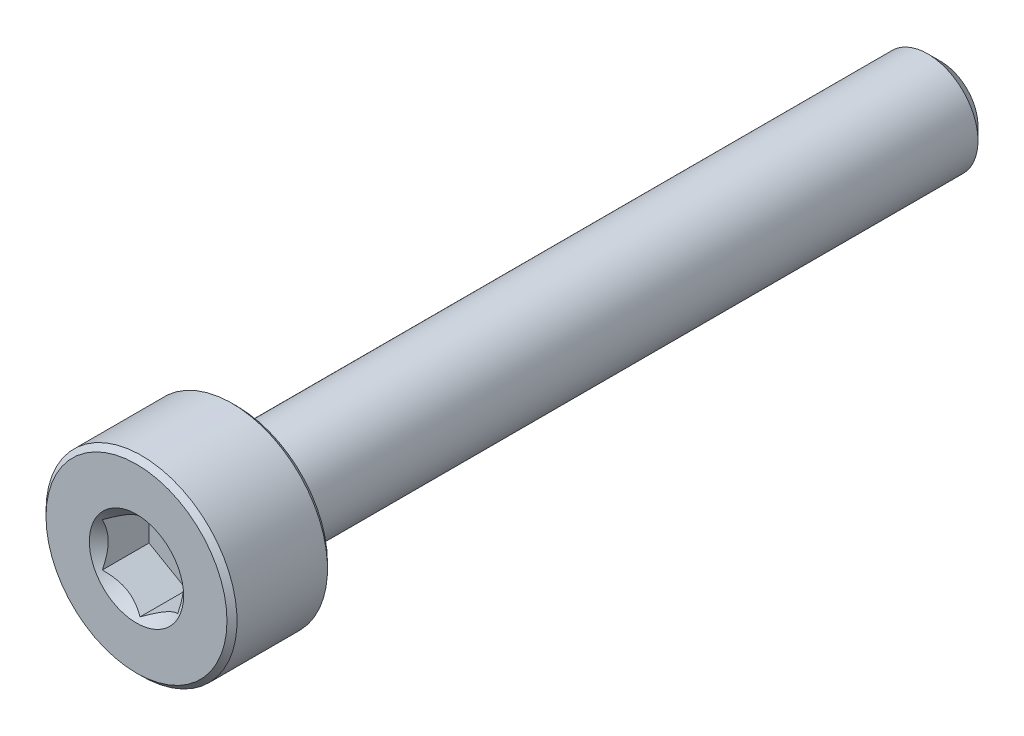
ISO-10303-21;
HEADER;
FILE_DESCRIPTION(('STEP AP214'),'2;1');
FILE_NAME('part.step','',(''),(''),'','','');
FILE_SCHEMA(('AUTOMOTIVE_DESIGN { 1 0 10303 214 1 1 1 1 }'));
ENDSEC;
DATA;
#1=APPLICATION_CONTEXT('core data for automotive mechanical design processes');
#2=APPLICATION_PROTOCOL_DEFINITION('international standard','automotive_design',2000,#1);
#3=PRODUCT_CONTEXT('',#1,'mechanical');
#4=PRODUCT('Part','Part','',(#3));
#5=PRODUCT_RELATED_PRODUCT_CATEGORY('part','',(#4));
#6=PRODUCT_DEFINITION_FORMATION('','',#4);
#7=PRODUCT_DEFINITION_CONTEXT('part definition',#1,'design');
#8=PRODUCT_DEFINITION('design','',#6,#7);
#9=PRODUCT_DEFINITION_SHAPE('','',#8);
#10=(LENGTH_UNIT() NAMED_UNIT(*) SI_UNIT(.MILLI.,.METRE.));
#11=(NAMED_UNIT(*) PLANE_ANGLE_UNIT() SI_UNIT($,.RADIAN.));
#12=(NAMED_UNIT(*) SI_UNIT($,.STERADIAN.) SOLID_ANGLE_UNIT());
#13=UNCERTAINTY_MEASURE_WITH_UNIT(LENGTH_MEASURE(1.E-05),#10,'distance_accuracy_value','');
#14=(GEOMETRIC_REPRESENTATION_CONTEXT(3) GLOBAL_UNCERTAINTY_ASSIGNED_CONTEXT((#13)) GLOBAL_UNIT_ASSIGNED_CONTEXT((#10,
#11,#12)) REPRESENTATION_CONTEXT('',''));
#15=CARTESIAN_POINT('',(0.,0.,0.));
#16=DIRECTION('',(0.,0.,1.));
#17=DIRECTION('',(1.,0.,0.));
#18=AXIS2_PLACEMENT_3D('',#15,#16,#17);
#19=CARTESIAN_POINT('',(0.,0.740192378864671,-8.));
#20=DIRECTION('',(0.,0.,-1.));
#21=DIRECTION('',(-1.,0.,0.));
#22=AXIS2_PLACEMENT_3D('',#19,#20,#21);
#23=PLANE('',#22);
#24=CARTESIAN_POINT('',(0.,0.,-8.));
#25=DIRECTION('',(0.,0.,-1.));
#26=DIRECTION('',(-1.,0.,0.));
#27=AXIS2_PLACEMENT_3D('',#24,#25,#26);
#28=CIRCLE('',#27,0.740192378864671);
#29=CARTESIAN_POINT('',(-0.740192378864671,0.,-8.));
#30=VERTEX_POINT('',#29);
#31=EDGE_CURVE('E56',#30,#30,#28,.T.);
#32=ORIENTED_EDGE('',*,*,#31,.T.);
#33=EDGE_LOOP('',(#32));
#34=FACE_BOUND('',#33,.T.);
#35=ADVANCED_FACE('F43',(#34),#23,.T.);
#36=CARTESIAN_POINT('',(0.,0.,-8.));
#37=DIRECTION('',(0.,0.,1.));
#38=DIRECTION('',(1.,0.,0.));
#39=AXIS2_PLACEMENT_3D('',#36,#37,#38);
#40=CONICAL_SURFACE('',#39,0.740192378864671,0.785398163397445);
#41=CARTESIAN_POINT('',(0.,0.,-7.74019237886467));
#42=DIRECTION('',(0.,0.,-1.));
#43=DIRECTION('',(-1.,0.,0.));
#44=AXIS2_PLACEMENT_3D('',#41,#42,#43);
#45=CIRCLE('',#44,1.);
#46=CARTESIAN_POINT('',(-1.,0.,-7.74019237886467));
#47=VERTEX_POINT('',#46);
#48=EDGE_CURVE('E159',#47,#47,#45,.T.);
#49=ORIENTED_EDGE('',*,*,#48,.T.);
#50=EDGE_LOOP('',(#49));
#51=FACE_BOUND('',#50,.T.);
#52=ORIENTED_EDGE('',*,*,#31,.F.);
#53=EDGE_LOOP('',(#52));
#54=FACE_BOUND('',#53,.T.);
#55=ADVANCED_FACE('F165',(#51,#54),#40,.T.);
#56=CARTESIAN_POINT('',(0.,0.,-8.));
#57=DIRECTION('',(0.,0.,-1.));
#58=DIRECTION('',(-1.,0.,0.));
#59=AXIS2_PLACEMENT_3D('',#56,#57,#58);
#60=CYLINDRICAL_SURFACE('',#59,1.);
#61=CARTESIAN_POINT('',(0.,0.,5.8));
#62=DIRECTION('',(0.,0.,-1.));
#63=DIRECTION('',(-1.,0.,0.));
#64=AXIS2_PLACEMENT_3D('',#61,#62,#63);
#65=CIRCLE('',#64,1.);
#66=CARTESIAN_POINT('',(-1.,0.,5.8));
#67=VERTEX_POINT('',#66);
#68=EDGE_CURVE('E156',#67,#67,#65,.T.);
#69=ORIENTED_EDGE('',*,*,#68,.T.);
#70=EDGE_LOOP('',(#69));
#71=FACE_BOUND('',#70,.T.);
#72=ORIENTED_EDGE('',*,*,#48,.F.);
#73=EDGE_LOOP('',(#72));
#74=FACE_BOUND('',#73,.T.);
#75=ADVANCED_FACE('F167',(#71,#74),#60,.T.);
#76=CARTESIAN_POINT('',(0.,0.,5.8));
#77=DIRECTION('',(0.,0.,-1.));
#78=DIRECTION('',(-1.,0.,0.));
#79=AXIS2_PLACEMENT_3D('',#76,#77,#78);
#80=TOROIDAL_SURFACE('',#79,1.2,0.199999999999999);
#81=CARTESIAN_POINT('',(0.,0.,6.));
#82=DIRECTION('',(0.,0.,-1.));
#83=DIRECTION('',(-1.,0.,0.));
#84=AXIS2_PLACEMENT_3D('',#81,#82,#83);
#85=CIRCLE('',#84,1.2);
#86=CARTESIAN_POINT('',(-1.2,0.,6.));
#87=VERTEX_POINT('',#86);
#88=EDGE_CURVE('E153',#87,#87,#85,.T.);
#89=ORIENTED_EDGE('',*,*,#88,.T.);
#90=EDGE_LOOP('',(#89));
#91=FACE_BOUND('',#90,.T.);
#92=ORIENTED_EDGE('',*,*,#68,.F.);
#93=EDGE_LOOP('',(#92));
#94=FACE_BOUND('',#93,.T.);
#95=ADVANCED_FACE('F173',(#91,#94),#80,.F.);
#96=CARTESIAN_POINT('',(0.,1.8,6.));
#97=DIRECTION('',(0.,0.,-1.));
#98=DIRECTION('',(-1.,0.,0.));
#99=AXIS2_PLACEMENT_3D('',#96,#97,#98);
#100=PLANE('',#99);
#101=CARTESIAN_POINT('',(0.,0.,6.));
#102=DIRECTION('',(0.,0.,-1.));
#103=DIRECTION('',(-1.,0.,0.));
#104=AXIS2_PLACEMENT_3D('',#101,#102,#103);
#105=CIRCLE('',#104,1.8);
#106=CARTESIAN_POINT('',(-1.8,0.,6.));
#107=VERTEX_POINT('',#106);
#108=EDGE_CURVE('E150',#107,#107,#105,.T.);
#109=ORIENTED_EDGE('',*,*,#108,.T.);
#110=EDGE_LOOP('',(#109));
#111=FACE_BOUND('',#110,.T.);
#112=ORIENTED_EDGE('',*,*,#88,.F.);
#113=EDGE_LOOP('',(#112));
#114=FACE_BOUND('',#113,.T.);
#115=ADVANCED_FACE('F179',(#111,#114),#100,.T.);
#116=CARTESIAN_POINT('',(0.,0.,6.));
#117=DIRECTION('',(0.,0.,1.));
#118=DIRECTION('',(1.,0.,0.));
#119=AXIS2_PLACEMENT_3D('',#116,#117,#118);
#120=CONICAL_SURFACE('',#119,1.8,0.785398163397452);
#121=CARTESIAN_POINT('',(0.,0.,6.1));
#122=DIRECTION('',(0.,0.,-1.));
#123=DIRECTION('',(-1.,0.,0.));
#124=AXIS2_PLACEMENT_3D('',#121,#122,#123);
#125=CIRCLE('',#124,1.9);
#126=CARTESIAN_POINT('',(-1.9,0.,6.1));
#127=VERTEX_POINT('',#126);
#128=EDGE_CURVE('E147',#127,#127,#125,.T.);
#129=ORIENTED_EDGE('',*,*,#128,.T.);
#130=EDGE_LOOP('',(#129));
#131=FACE_BOUND('',#130,.T.);
#132=ORIENTED_EDGE('',*,*,#108,.F.);
#133=EDGE_LOOP('',(#132));
#134=FACE_BOUND('',#133,.T.);
#135=ADVANCED_FACE('F183',(#131,#134),#120,.T.);
#136=CARTESIAN_POINT('',(0.,0.,-8.));
#137=DIRECTION('',(0.,0.,-1.));
#138=DIRECTION('',(-1.,0.,0.));
#139=AXIS2_PLACEMENT_3D('',#136,#137,#138);
#140=CYLINDRICAL_SURFACE('',#139,1.9);
#141=CARTESIAN_POINT('',(0.,0.,7.9));
#142=DIRECTION('',(0.,0.,-1.));
#143=DIRECTION('',(-1.,0.,0.));
#144=AXIS2_PLACEMENT_3D('',#141,#142,#143);
#145=CIRCLE('',#144,1.9);
#146=CARTESIAN_POINT('',(-1.9,0.,7.9));
#147=VERTEX_POINT('',#146);
#148=EDGE_CURVE('E144',#147,#147,#145,.T.);
#149=ORIENTED_EDGE('',*,*,#148,.T.);
#150=EDGE_LOOP('',(#149));
#151=FACE_BOUND('',#150,.T.);
#152=ORIENTED_EDGE('',*,*,#128,.F.);
#153=EDGE_LOOP('',(#152));
#154=FACE_BOUND('',#153,.T.);
#155=ADVANCED_FACE('F187',(#151,#154),#140,.T.);
#156=CARTESIAN_POINT('',(0.,0.,7.9));
#157=DIRECTION('',(0.,0.,-1.));
#158=DIRECTION('',(-1.,0.,0.));
#159=AXIS2_PLACEMENT_3D('',#156,#157,#158);
#160=CONICAL_SURFACE('',#159,1.9,0.785398163397452);
#161=CARTESIAN_POINT('',(0.,0.,8.));
#162=DIRECTION('',(0.,0.,-1.));
#163=DIRECTION('',(-1.,0.,0.));
#164=AXIS2_PLACEMENT_3D('',#161,#162,#163);
#165=CIRCLE('',#164,1.8);
#166=CARTESIAN_POINT('',(-1.8,0.,8.));
#167=VERTEX_POINT('',#166);
#168=EDGE_CURVE('E141',#167,#167,#165,.T.);
#169=ORIENTED_EDGE('',*,*,#168,.T.);
#170=EDGE_LOOP('',(#169));
#171=FACE_BOUND('',#170,.T.);
#172=ORIENTED_EDGE('',*,*,#148,.F.);
#173=EDGE_LOOP('',(#172));
#174=FACE_BOUND('',#173,.T.);
#175=ADVANCED_FACE('F191',(#171,#174),#160,.T.);
#176=CARTESIAN_POINT('',(0.,0.,8.));
#177=DIRECTION('',(0.,0.,1.));
#178=DIRECTION('',(1.,0.,0.));
#179=AXIS2_PLACEMENT_3D('',#176,#177,#178);
#180=PLANE('',#179);
#181=CARTESIAN_POINT('',(0.,0.,8.));
#182=DIRECTION('',(0.,0.,1.));
#183=DIRECTION('',(1.,0.,0.));
#184=AXIS2_PLACEMENT_3D('',#181,#182,#183);
#185=CIRCLE('',#184,0.9375);
#186=CARTESIAN_POINT('',(0.9375,0.,8.));
#187=VERTEX_POINT('',#186);
#188=EDGE_CURVE('E115',#187,#187,#185,.T.);
#189=ORIENTED_EDGE('',*,*,#188,.F.);
#190=EDGE_LOOP('',(#189));
#191=FACE_BOUND('',#190,.T.);
#192=ORIENTED_EDGE('',*,*,#168,.F.);
#193=EDGE_LOOP('',(#192));
#194=FACE_BOUND('',#193,.T.);
#195=ADVANCED_FACE('F195',(#191,#194),#180,.T.);
#196=CARTESIAN_POINT('',(0.,0.,8.));
#197=DIRECTION('',(0.,0.,1.));
#198=DIRECTION('',(1.,0.,0.));
#199=AXIS2_PLACEMENT_3D('',#196,#197,#198);
#200=CONICAL_SURFACE('',#199,0.9375,0.78539816339745);
#201=ORIENTED_EDGE('',*,*,#188,.T.);
#202=EDGE_LOOP('',(#201));
#203=FACE_BOUND('',#202,.T.);
#204=CARTESIAN_POINT('',(-0.000199999999999958,-0.866140873838277,7.92864089692921));
#205=CARTESIAN_POINT('',(0.0255899625576813,-0.851251032013209,7.91375951424836));
#206=CARTESIAN_POINT('',(0.0518112021286592,-0.836112192288419,7.89975166939139));
#207=CARTESIAN_POINT('',(0.105279708235707,-0.805242135894348,7.8741029284667));
#208=CARTESIAN_POINT('',(0.132532067460573,-0.789507978959819,7.86247631549011));
#209=CARTESIAN_POINT('',(0.187485350381353,-0.757780686272653,7.84255944955668));
#210=CARTESIAN_POINT('',(0.21517225669551,-0.741795643459147,7.83421909786581));
#211=CARTESIAN_POINT('',(0.271155595130854,-0.709473647943367,7.82136814574587));
#212=CARTESIAN_POINT('',(0.299450314843646,-0.693137683900542,7.81684794437328));
#213=CARTESIAN_POINT('',(0.348210289268844,-0.664986099540474,7.81277123688187));
#214=CARTESIAN_POINT('',(0.368612065655573,-0.65320712845165,7.81216820039852));
#215=CARTESIAN_POINT('',(0.409376134696361,-0.629671982217686,7.81317990979997));
#216=CARTESIAN_POINT('',(0.429738417651456,-0.617915812672247,7.81479514477447));
#217=CARTESIAN_POINT('',(0.490534543086825,-0.582815153286451,7.82286155075748));
#218=CARTESIAN_POINT('',(0.5306658549961,-0.559645329552698,7.83253433961216));
#219=CARTESIAN_POINT('',(0.601110400354026,-0.518974152327358,7.85588172175675));
#220=CARTESIAN_POINT('',(0.631753572009087,-0.501282308923485,7.86833396185669));
#221=CARTESIAN_POINT('',(0.69183934580479,-0.466591771248069,7.8963850140153));
#222=CARTESIAN_POINT('',(0.721285488381591,-0.449591032904757,7.91197358968819));
#223=CARTESIAN_POINT('',(0.7502,-0.432897231838382,7.92864089692921));
#224=B_SPLINE_CURVE_WITH_KNOTS('',3,(#204,#205,#206,#207,#208,#209,#210,#211,#212,#213,#214,
#215,#216,#217,#218,#219,#220,#221,#222,#223),.UNSPECIFIED.,.F.,.F.,(4,2,2,2,2,2,2,2,2,4),(0.,
0.0999419466095602,0.200466857654446,0.299393763705718,0.398071297300231,0.468665775681748,
0.53927582139884,0.680536257244567,0.792918418368074,0.904939568716031),.UNSPECIFIED.);
#225=CARTESIAN_POINT('',(0.,-0.866025403784439,7.92852540378444));
#226=VERTEX_POINT('',#225);
#227=CARTESIAN_POINT('',(0.75,-0.43301270189222,7.92852540378444));
#228=VERTEX_POINT('',#227);
#229=EDGE_CURVE('E12',#226,#228,#224,.T.);
#230=ORIENTED_EDGE('',*,*,#229,.F.);
#231=CARTESIAN_POINT('',(-0.7502,-0.432897231838382,7.92864089692921));
#232=CARTESIAN_POINT('',(-0.724410037442318,-0.447787073663449,7.91375951424836));
#233=CARTESIAN_POINT('',(-0.69818879787134,-0.462925913388239,7.89975166939139));
#234=CARTESIAN_POINT('',(-0.644720291764293,-0.49379596978231,7.8741029284667));
#235=CARTESIAN_POINT('',(-0.617467932539427,-0.509530126716839,7.8624763154901));
#236=CARTESIAN_POINT('',(-0.562514649618646,-0.541257419404006,7.84255944955668));
#237=CARTESIAN_POINT('',(-0.53482774330449,-0.557242462217512,7.83421909786581));
#238=CARTESIAN_POINT('',(-0.478844404869146,-0.589564457733291,7.82136814574587));
#239=CARTESIAN_POINT('',(-0.450549685156354,-0.605900421776116,7.81684794437327));
#240=CARTESIAN_POINT('',(-0.401789710731156,-0.634052006136184,7.81277123688187));
#241=CARTESIAN_POINT('',(-0.381387934344427,-0.645830977225009,7.81216820039852));
#242=CARTESIAN_POINT('',(-0.340623865303639,-0.669366123458972,7.81317990979997));
#243=CARTESIAN_POINT('',(-0.320261582348544,-0.681122293004411,7.81479514477447));
#244=CARTESIAN_POINT('',(-0.259465456913175,-0.716222952390208,7.82286155075748));
#245=CARTESIAN_POINT('',(-0.2193341450039,-0.739392776123961,7.83253433961216));
#246=CARTESIAN_POINT('',(-0.148889599645974,-0.7800639533493,7.85588172175675));
#247=CARTESIAN_POINT('',(-0.118246427990913,-0.797755796753173,7.86833396185669));
#248=CARTESIAN_POINT('',(-0.05816065419521,-0.83244633442859,7.8963850140153));
#249=CARTESIAN_POINT('',(-0.0287145116184093,-0.849447072771901,7.91197358968819));
#250=CARTESIAN_POINT('',(0.000199999999999707,-0.866140873838276,7.92864089692921));
#251=B_SPLINE_CURVE_WITH_KNOTS('',3,(#231,#232,#233,#234,#235,#236,#237,#238,#239,#240,#241,
#242,#243,#244,#245,#246,#247,#248,#249,#250),.UNSPECIFIED.,.F.,.F.,(4,2,2,2,2,2,2,2,2,4),(0.,
0.0999419466095602,0.200466857654447,0.299393763705718,0.398071297300231,0.468665775681748,
0.53927582139884,0.680536257244567,0.792918418368074,0.904939568716031),.UNSPECIFIED.);
#252=CARTESIAN_POINT('',(-0.749999999999999,-0.43301270189222,7.92852540378444));
#253=VERTEX_POINT('',#252);
#254=EDGE_CURVE('E101',#253,#226,#251,.T.);
#255=ORIENTED_EDGE('',*,*,#254,.F.);
#256=CARTESIAN_POINT('',(-0.749999999999999,-0.913623081515065,8.24453516659915));
#257=CARTESIAN_POINT('',(-0.749999999999999,-0.891587934056342,8.22750617490328));
#258=CARTESIAN_POINT('',(-0.749999999999999,-0.869435609302313,8.2106292698566));
#259=CARTESIAN_POINT('',(-0.749999999999999,-0.824847362255834,8.17724385668654));
#260=CARTESIAN_POINT('',(-0.749999999999999,-0.802411375588701,8.16073543462633));
#261=CARTESIAN_POINT('',(-0.749999999999999,-0.734276071637828,8.11162355047093));
#262=CARTESIAN_POINT('',(-0.75,-0.688082871753294,8.07969436020913));
#263=CARTESIAN_POINT('',(-0.75,-0.590878824423271,8.01653286106833));
#264=CARTESIAN_POINT('',(-0.75,-0.539749896042761,7.98548034048947));
#265=CARTESIAN_POINT('',(-0.75,-0.434881984782017,7.92834813059631));
#266=CARTESIAN_POINT('',(-0.75,-0.381152620431967,7.90225164613688));
#267=CARTESIAN_POINT('',(-0.75,-0.300958051798766,7.8703142834118));
#268=CARTESIAN_POINT('',(-0.75,-0.275793033906304,7.86123826752818));
#269=CARTESIAN_POINT('',(-0.75,-0.224826538126441,7.84509659728151));
#270=CARTESIAN_POINT('',(-0.75,-0.199025020520126,7.83803106872369));
#271=CARTESIAN_POINT('',(-0.75,-0.121798778348913,7.82071041981678));
#272=CARTESIAN_POINT('',(-0.75,-0.0695159130538485,7.81388815020023));
#273=CARTESIAN_POINT('',(-0.75,0.0329231759441416,7.81155614914664));
#274=CARTESIAN_POINT('',(-0.75,0.0830673936221563,7.8155436776996));
#275=CARTESIAN_POINT('',(-0.75,0.157437365189135,7.82843772151154));
#276=CARTESIAN_POINT('',(-0.75,0.182318088526611,7.83397445658713));
#277=CARTESIAN_POINT('',(-0.75,0.231540192191707,7.84707138969148));
#278=CARTESIAN_POINT('',(-0.75,0.255881599358774,7.8546314867802));
#279=CARTESIAN_POINT('',(-0.75,0.330397144501019,7.8806790666465));
#280=CARTESIAN_POINT('',(-0.75,0.379559057166921,7.90204407345706));
#281=CARTESIAN_POINT('',(-0.75,0.475591510108889,7.94959498765407));
#282=CARTESIAN_POINT('',(-0.75,0.522453259746742,7.97579780486856));
#283=CARTESIAN_POINT('',(-0.75,0.61203536346179,8.02990968941325));
#284=CARTESIAN_POINT('',(-0.75,0.654846018126321,8.05767119410216));
#285=CARTESIAN_POINT('',(-0.75,0.717918628006985,8.10061102002081));
#286=CARTESIAN_POINT('',(-0.75,0.738671754913954,8.11508031004262));
#287=CARTESIAN_POINT('',(-0.75,0.779893140743972,8.14440776475374));
#288=CARTESIAN_POINT('',(-0.75,0.800361476224038,8.15926582171623));
#289=CARTESIAN_POINT('',(-0.75,0.820710970137172,8.17428527445883));
#290=B_SPLINE_CURVE_WITH_KNOTS('',3,(#256,#257,#258,#259,#260,#261,#262,#263,#264,#265,#266,
#267,#268,#269,#270,#271,#272,#273,#274,#275,#276,#277,#278,#279,#280,#281,#282,#283,#284,#285,
#286,#287,#288,#289),.UNSPECIFIED.,.F.,.F.,(4,2,2,2,2,2,2,2,2,2,2,2,2,2,2,2,4),(0.,
0.0835433027134516,0.167105917903213,0.335500649126496,0.514826793989733,0.693533944085575,
0.773715029057593,0.853901130217463,1.01093644141579,1.1607951616589,1.2371879502019,
1.31357692842629,1.47392517984358,1.63484489590006,1.78784031994658,1.86373509862529,
1.93960906513721),.UNSPECIFIED.);
#291=CARTESIAN_POINT('',(-0.75,0.43301270189222,7.92852540378444));
#292=VERTEX_POINT('',#291);
#293=EDGE_CURVE('E114',#292,#253,#290,.F.);
#294=ORIENTED_EDGE('',*,*,#293,.F.);
#295=CARTESIAN_POINT('',(0.000200000000000048,0.866140873838277,7.92864089692921));
#296=CARTESIAN_POINT('',(-0.0255899625576813,0.851251032013209,7.91375951424836));
#297=CARTESIAN_POINT('',(-0.0518112021286588,0.836112192288419,7.8997516693914));
#298=CARTESIAN_POINT('',(-0.105279708235706,0.805242135894349,7.8741029284667));
#299=CARTESIAN_POINT('',(-0.132532067460572,0.78950797895982,7.86247631549011));
#300=CARTESIAN_POINT('',(-0.187485350381352,0.757780686272654,7.84255944955668));
#301=CARTESIAN_POINT('',(-0.215172256695509,0.741795643459148,7.83421909786581));
#302=CARTESIAN_POINT('',(-0.271155595130853,0.709473647943368,7.82136814574587));
#303=CARTESIAN_POINT('',(-0.299450314843645,0.693137683900543,7.81684794437328));
#304=CARTESIAN_POINT('',(-0.348210289268843,0.664986099540475,7.81277123688187));
#305=CARTESIAN_POINT('',(-0.368612065655572,0.65320712845165,7.81216820039852));
#306=CARTESIAN_POINT('',(-0.40937613469636,0.629671982217687,7.81317990979997));
#307=CARTESIAN_POINT('',(-0.429738417651455,0.617915812672248,7.81479514477447));
#308=CARTESIAN_POINT('',(-0.490534543086824,0.582815153286451,7.82286155075748));
#309=CARTESIAN_POINT('',(-0.530665854996099,0.559645329552698,7.83253433961216));
#310=CARTESIAN_POINT('',(-0.601110400354026,0.518974152327359,7.85588172175675));
#311=CARTESIAN_POINT('',(-0.631753572009086,0.501282308923486,7.86833396185669));
#312=CARTESIAN_POINT('',(-0.691839345804789,0.46659177124807,7.8963850140153));
#313=CARTESIAN_POINT('',(-0.72128548838159,0.449591032904757,7.91197358968819));
#314=CARTESIAN_POINT('',(-0.750199999999999,0.432897231838382,7.92864089692921));
#315=B_SPLINE_CURVE_WITH_KNOTS('',3,(#295,#296,#297,#298,#299,#300,#301,#302,#303,#304,#305,
#306,#307,#308,#309,#310,#311,#312,#313,#314),.UNSPECIFIED.,.F.,.F.,(4,2,2,2,2,2,2,2,2,4),(0.,
0.0999419466095586,0.200466857654445,0.299393763705717,0.39807129730023,0.468665775681747,
0.539275821398839,0.680536257244566,0.792918418368073,0.904939568716031),.UNSPECIFIED.);
#316=CARTESIAN_POINT('',(0.,0.866025403784439,7.92852540378444));
#317=VERTEX_POINT('',#316);
#318=EDGE_CURVE('E245',#317,#292,#315,.T.);
#319=ORIENTED_EDGE('',*,*,#318,.F.);
#320=CARTESIAN_POINT('',(0.7502,0.432897231838382,7.92864089692921));
#321=CARTESIAN_POINT('',(0.724410037442318,0.44778707366345,7.91375951424836));
#322=CARTESIAN_POINT('',(0.69818879787134,0.46292591338824,7.8997516693914));
#323=CARTESIAN_POINT('',(0.644720291764293,0.49379596978231,7.8741029284667));
#324=CARTESIAN_POINT('',(0.617467932539427,0.509530126716839,7.86247631549011));
#325=CARTESIAN_POINT('',(0.562514649618647,0.541257419404006,7.84255944955668));
#326=CARTESIAN_POINT('',(0.53482774330449,0.557242462217512,7.83421909786581));
#327=CARTESIAN_POINT('',(0.478844404869147,0.589564457733291,7.82136814574587));
#328=CARTESIAN_POINT('',(0.450549685156355,0.605900421776116,7.81684794437328));
#329=CARTESIAN_POINT('',(0.401789710731157,0.634052006136184,7.81277123688187));
#330=CARTESIAN_POINT('',(0.381387934344427,0.645830977225009,7.81216820039852));
#331=CARTESIAN_POINT('',(0.34062386530364,0.669366123458972,7.81317990979997));
#332=CARTESIAN_POINT('',(0.320261582348545,0.681122293004411,7.81479514477447));
#333=CARTESIAN_POINT('',(0.259465456913176,0.716222952390208,7.82286155075748));
#334=CARTESIAN_POINT('',(0.219334145003901,0.73939277612396,7.83253433961216));
#335=CARTESIAN_POINT('',(0.148889599645974,0.7800639533493,7.85588172175675));
#336=CARTESIAN_POINT('',(0.118246427990914,0.797755796753173,7.86833396185669));
#337=CARTESIAN_POINT('',(0.0581606541952104,0.832446334428589,7.8963850140153));
#338=CARTESIAN_POINT('',(0.0287145116184094,0.849447072771901,7.91197358968819));
#339=CARTESIAN_POINT('',(-0.000199999999999654,0.866140873838277,7.92864089692921));
#340=B_SPLINE_CURVE_WITH_KNOTS('',3,(#320,#321,#322,#323,#324,#325,#326,#327,#328,#329,#330,
#331,#332,#333,#334,#335,#336,#337,#338,#339),.UNSPECIFIED.,.F.,.F.,(4,2,2,2,2,2,2,2,2,4),(0.,
0.0999419466095597,0.200466857654446,0.299393763705717,0.39807129730023,0.468665775681747,
0.539275821398839,0.680536257244566,0.792918418368073,0.904939568716031),.UNSPECIFIED.);
#341=CARTESIAN_POINT('',(0.75,0.43301270189222,7.92852540378444));
#342=VERTEX_POINT('',#341);
#343=EDGE_CURVE('E218',#342,#317,#340,.T.);
#344=ORIENTED_EDGE('',*,*,#343,.F.);
#345=CARTESIAN_POINT('',(0.75,-0.913623162143353,8.24453522891867));
#346=CARTESIAN_POINT('',(0.75,-0.891588012342561,8.22750623480797));
#347=CARTESIAN_POINT('',(0.75,-0.869435685239549,8.21062932735027));
#348=CARTESIAN_POINT('',(0.75,-0.824847433472996,8.17724390937191));
#349=CARTESIAN_POINT('',(0.75,-0.802411444434766,8.16073548491442));
#350=CARTESIAN_POINT('',(0.75,-0.734276133230785,8.11162359351943));
#351=CARTESIAN_POINT('',(0.75,-0.688082928418122,8.0796943984501));
#352=CARTESIAN_POINT('',(0.75,-0.590878870331563,8.01653288937767));
#353=CARTESIAN_POINT('',(0.75,-0.539749936093781,7.98548036371058));
#354=CARTESIAN_POINT('',(0.75,-0.43488201262553,7.92834814436712));
#355=CARTESIAN_POINT('',(0.75,-0.381152641929382,7.90225165553938));
#356=CARTESIAN_POINT('',(0.75,-0.300958068560203,7.8703142897134));
#357=CARTESIAN_POINT('',(0.75,-0.275793052729062,7.86123827409276));
#358=CARTESIAN_POINT('',(0.75,-0.22482656115005,7.84509660396467));
#359=CARTESIAN_POINT('',(0.75,-0.199025045683182,7.83803107526269));
#360=CARTESIAN_POINT('',(0.75,-0.12179880979148,7.82071042514642));
#361=CARTESIAN_POINT('',(0.75,-0.0695159487001801,7.81388815376272));
#362=CARTESIAN_POINT('',(0.75,0.0329231335148145,7.81155614748937));
#363=CARTESIAN_POINT('',(0.75,0.0830673485907532,7.81554367284219));
#364=CARTESIAN_POINT('',(0.75,0.157437316619036,7.82843771156002));
#365=CARTESIAN_POINT('',(0.75,0.182318038779739,7.83397444485178));
#366=CARTESIAN_POINT('',(0.75,0.231540140218073,7.84707137437245));
#367=CARTESIAN_POINT('',(0.75,0.255881546335133,7.85463146966138));
#368=CARTESIAN_POINT('',(0.75,0.330397080263752,7.88067904120024));
#369=CARTESIAN_POINT('',(0.75,0.37955898333088,7.90204404037615));
#370=CARTESIAN_POINT('',(0.75,0.475591417813352,7.94959493845518));
#371=CARTESIAN_POINT('',(0.75,0.522453158594996,7.97579774718032));
#372=CARTESIAN_POINT('',(0.75,0.612035246419323,8.02990961548259));
#373=CARTESIAN_POINT('',(0.75,0.654845893991357,8.05767111249543));
#374=CARTESIAN_POINT('',(0.75,0.717918493386946,8.10061092693989));
#375=CARTESIAN_POINT('',(0.75,0.738671616849601,8.11508021316739));
#376=CARTESIAN_POINT('',(0.75,0.77989299581379,8.14440766029472));
#377=CARTESIAN_POINT('',(0.75,0.800361327872347,8.15926571346771));
#378=CARTESIAN_POINT('',(0.75,0.820710818370217,8.17428516242569));
#379=B_SPLINE_CURVE_WITH_KNOTS('',3,(#345,#346,#347,#348,#349,#350,#351,#352,#353,#354,#355,
#356,#357,#358,#359,#360,#361,#362,#363,#364,#365,#366,#367,#368,#369,#370,#371,#372,#373,#374,
#375,#376,#377,#378),.UNSPECIFIED.,.F.,.F.,(4,2,2,2,2,2,2,2,2,2,2,2,2,2,2,2,4),(0.,
0.0835433127025599,0.167105937884327,0.335500689465543,0.514826857265769,0.693534030076223,
0.773715108985907,0.853901204093905,1.01093650381525,1.16079521562931,1.23718799955929,
1.31357697317255,1.47392518920382,1.6348448696413,1.78784026330145,1.86373502699302,
1.93960897851903),.UNSPECIFIED.);
#380=EDGE_CURVE('E63',#228,#342,#379,.T.);
#381=ORIENTED_EDGE('',*,*,#380,.F.);
#382=EDGE_LOOP('',(#230,#255,#294,#319,#344,#381));
#383=FACE_BOUND('',#382,.T.);
#384=ADVANCED_FACE('F100',(#203,#383),#200,.F.);
#385=CARTESIAN_POINT('',(0.,1.8,7.));
#386=DIRECTION('',(0.,0.,-1.));
#387=DIRECTION('',(-1.,0.,0.));
#388=AXIS2_PLACEMENT_3D('',#385,#386,#387);
#389=PLANE('',#388);
#390=DIRECTION('',(0.866025403784439,0.5,0.));
#391=VECTOR('',#390,1.);
#392=CARTESIAN_POINT('',(0.,-0.866025403784439,7.));
#393=LINE('',#392,#391);
#394=CARTESIAN_POINT('',(0.,-0.866025403784439,7.));
#395=VERTEX_POINT('',#394);
#396=CARTESIAN_POINT('',(0.75,-0.43301270189222,7.));
#397=VERTEX_POINT('',#396);
#398=EDGE_CURVE('E118',#395,#397,#393,.T.);
#399=ORIENTED_EDGE('',*,*,#398,.T.);
#400=DIRECTION('',(0.,1.,0.));
#401=VECTOR('',#400,1.);
#402=CARTESIAN_POINT('',(0.75,-0.43301270189222,7.));
#403=LINE('',#402,#401);
#404=CARTESIAN_POINT('',(0.75,0.43301270189222,7.));
#405=VERTEX_POINT('',#404);
#406=EDGE_CURVE('E70',#397,#405,#403,.T.);
#407=ORIENTED_EDGE('',*,*,#406,.T.);
#408=DIRECTION('',(-0.866025403784439,0.5,0.));
#409=VECTOR('',#408,1.);
#410=CARTESIAN_POINT('',(0.75,0.43301270189222,7.));
#411=LINE('',#410,#409);
#412=CARTESIAN_POINT('',(0.,0.866025403784439,7.));
#413=VERTEX_POINT('',#412);
#414=EDGE_CURVE('E126',#405,#413,#411,.T.);
#415=ORIENTED_EDGE('',*,*,#414,.T.);
#416=DIRECTION('',(-0.866025403784439,-0.5,0.));
#417=VECTOR('',#416,1.);
#418=CARTESIAN_POINT('',(0.,0.866025403784439,7.));
#419=LINE('',#418,#417);
#420=CARTESIAN_POINT('',(-0.75,0.43301270189222,7.));
#421=VERTEX_POINT('',#420);
#422=EDGE_CURVE('E133',#413,#421,#419,.T.);
#423=ORIENTED_EDGE('',*,*,#422,.T.);
#424=DIRECTION('',(0.,-1.,0.));
#425=VECTOR('',#424,1.);
#426=CARTESIAN_POINT('',(-0.75,0.43301270189222,7.));
#427=LINE('',#426,#425);
#428=CARTESIAN_POINT('',(-0.75,-0.43301270189222,7.));
#429=VERTEX_POINT('',#428);
#430=EDGE_CURVE('E129',#421,#429,#427,.T.);
#431=ORIENTED_EDGE('',*,*,#430,.T.);
#432=DIRECTION('',(0.866025403784439,-0.5,0.));
#433=VECTOR('',#432,1.);
#434=CARTESIAN_POINT('',(-0.75,-0.43301270189222,7.));
#435=LINE('',#434,#433);
#436=EDGE_CURVE('E119',#429,#395,#435,.T.);
#437=ORIENTED_EDGE('',*,*,#436,.T.);
#438=EDGE_LOOP('',(#399,#407,#415,#423,#431,#437));
#439=FACE_BOUND('',#438,.T.);
#440=ADVANCED_FACE('F200',(#439),#389,.F.);
#441=CARTESIAN_POINT('',(0.,-0.866025403784439,3.70871215252208));
#442=DIRECTION('',(0.5,-0.866025403784439,0.));
#443=DIRECTION('',(0.866025403784439,0.5,0.));
#444=AXIS2_PLACEMENT_3D('',#441,#442,#443);
#445=PLANE('',#444);
#446=DIRECTION('',(0.,0.,1.));
#447=VECTOR('',#446,1.);
#448=CARTESIAN_POINT('',(0.,-0.866025403784439,3.70871215252208));
#449=LINE('',#448,#447);
#450=EDGE_CURVE('E110',#395,#226,#449,.T.);
#451=ORIENTED_EDGE('',*,*,#450,.T.);
#452=ORIENTED_EDGE('',*,*,#229,.T.);
#453=DIRECTION('',(0.,0.,1.));
#454=VECTOR('',#453,1.);
#455=CARTESIAN_POINT('',(0.75,-0.43301270189222,3.70871215252208));
#456=LINE('',#455,#454);
#457=EDGE_CURVE('E121',#397,#228,#456,.T.);
#458=ORIENTED_EDGE('',*,*,#457,.F.);
#459=ORIENTED_EDGE('',*,*,#398,.F.);
#460=EDGE_LOOP('',(#451,#452,#458,#459));
#461=FACE_BOUND('',#460,.T.);
#462=ADVANCED_FACE('F117',(#461),#445,.F.);
#463=CARTESIAN_POINT('',(-0.75,-0.43301270189222,3.70871215252208));
#464=DIRECTION('',(-0.5,-0.866025403784439,0.));
#465=DIRECTION('',(0.866025403784439,-0.5,0.));
#466=AXIS2_PLACEMENT_3D('',#463,#464,#465);
#467=PLANE('',#466);
#468=DIRECTION('',(0.,0.,1.));
#469=VECTOR('',#468,1.);
#470=CARTESIAN_POINT('',(-0.75,-0.43301270189222,3.70871215252208));
#471=LINE('',#470,#469);
#472=EDGE_CURVE('E113',#429,#253,#471,.T.);
#473=ORIENTED_EDGE('',*,*,#472,.T.);
#474=ORIENTED_EDGE('',*,*,#254,.T.);
#475=ORIENTED_EDGE('',*,*,#450,.F.);
#476=ORIENTED_EDGE('',*,*,#436,.F.);
#477=EDGE_LOOP('',(#473,#474,#475,#476));
#478=FACE_BOUND('',#477,.T.);
#479=ADVANCED_FACE('F109',(#478),#467,.F.);
#480=CARTESIAN_POINT('',(-0.75,0.43301270189222,3.70871215252208));
#481=DIRECTION('',(-1.,0.,0.));
#482=DIRECTION('',(0.,-1.,0.));
#483=AXIS2_PLACEMENT_3D('',#480,#481,#482);
#484=PLANE('',#483);
#485=DIRECTION('',(0.,0.,1.));
#486=VECTOR('',#485,1.);
#487=CARTESIAN_POINT('',(-0.75,0.43301270189222,3.70871215252208));
#488=LINE('',#487,#486);
#489=EDGE_CURVE('E130',#421,#292,#488,.T.);
#490=ORIENTED_EDGE('',*,*,#489,.T.);
#491=ORIENTED_EDGE('',*,*,#293,.T.);
#492=ORIENTED_EDGE('',*,*,#472,.F.);
#493=ORIENTED_EDGE('',*,*,#430,.F.);
#494=EDGE_LOOP('',(#490,#491,#492,#493));
#495=FACE_BOUND('',#494,.T.);
#496=ADVANCED_FACE('F254',(#495),#484,.F.);
#497=CARTESIAN_POINT('',(0.,0.866025403784439,3.70871215252208));
#498=DIRECTION('',(-0.5,0.866025403784439,0.));
#499=DIRECTION('',(-0.866025403784439,-0.5,0.));
#500=AXIS2_PLACEMENT_3D('',#497,#498,#499);
#501=PLANE('',#500);
#502=DIRECTION('',(0.,0.,1.));
#503=VECTOR('',#502,1.);
#504=CARTESIAN_POINT('',(0.,0.866025403784439,3.70871215252208));
#505=LINE('',#504,#503);
#506=EDGE_CURVE('E134',#413,#317,#505,.T.);
#507=ORIENTED_EDGE('',*,*,#506,.T.);
#508=ORIENTED_EDGE('',*,*,#318,.T.);
#509=ORIENTED_EDGE('',*,*,#489,.F.);
#510=ORIENTED_EDGE('',*,*,#422,.F.);
#511=EDGE_LOOP('',(#507,#508,#509,#510));
#512=FACE_BOUND('',#511,.T.);
#513=ADVANCED_FACE('F251',(#512),#501,.F.);
#514=CARTESIAN_POINT('',(0.75,0.43301270189222,3.70871215252208));
#515=DIRECTION('',(0.5,0.866025403784439,0.));
#516=DIRECTION('',(-0.866025403784439,0.5,0.));
#517=AXIS2_PLACEMENT_3D('',#514,#515,#516);
#518=PLANE('',#517);
#519=DIRECTION('',(0.,0.,1.));
#520=VECTOR('',#519,1.);
#521=CARTESIAN_POINT('',(0.75,0.43301270189222,3.70871215252208));
#522=LINE('',#521,#520);
#523=EDGE_CURVE('E137',#405,#342,#522,.T.);
#524=ORIENTED_EDGE('',*,*,#523,.T.);
#525=ORIENTED_EDGE('',*,*,#343,.T.);
#526=ORIENTED_EDGE('',*,*,#506,.F.);
#527=ORIENTED_EDGE('',*,*,#414,.F.);
#528=EDGE_LOOP('',(#524,#525,#526,#527));
#529=FACE_BOUND('',#528,.T.);
#530=ADVANCED_FACE('F208',(#529),#518,.F.);
#531=CARTESIAN_POINT('',(0.75,-0.43301270189222,3.70871215252208));
#532=DIRECTION('',(1.,0.,0.));
#533=DIRECTION('',(0.,1.,0.));
#534=AXIS2_PLACEMENT_3D('',#531,#532,#533);
#535=PLANE('',#534);
#536=ORIENTED_EDGE('',*,*,#457,.T.);
#537=ORIENTED_EDGE('',*,*,#380,.T.);
#538=ORIENTED_EDGE('',*,*,#523,.F.);
#539=ORIENTED_EDGE('',*,*,#406,.F.);
#540=EDGE_LOOP('',(#536,#537,#538,#539));
#541=FACE_BOUND('',#540,.T.);
#542=ADVANCED_FACE('F204',(#541),#535,.F.);
#543=CLOSED_SHELL('',(#35,#55,#75,#95,#115,#135,#155,#175,#195,#384,#440,#462,#479,#496,#513,
#530,#542));
#544=MANIFOLD_SOLID_BREP('B2',#543);
#545=ADVANCED_BREP_SHAPE_REPRESENTATION('',(#18,#544),#14);
#546=SHAPE_DEFINITION_REPRESENTATION(#9,#545);
ENDSEC;
END-ISO-10303-21;
